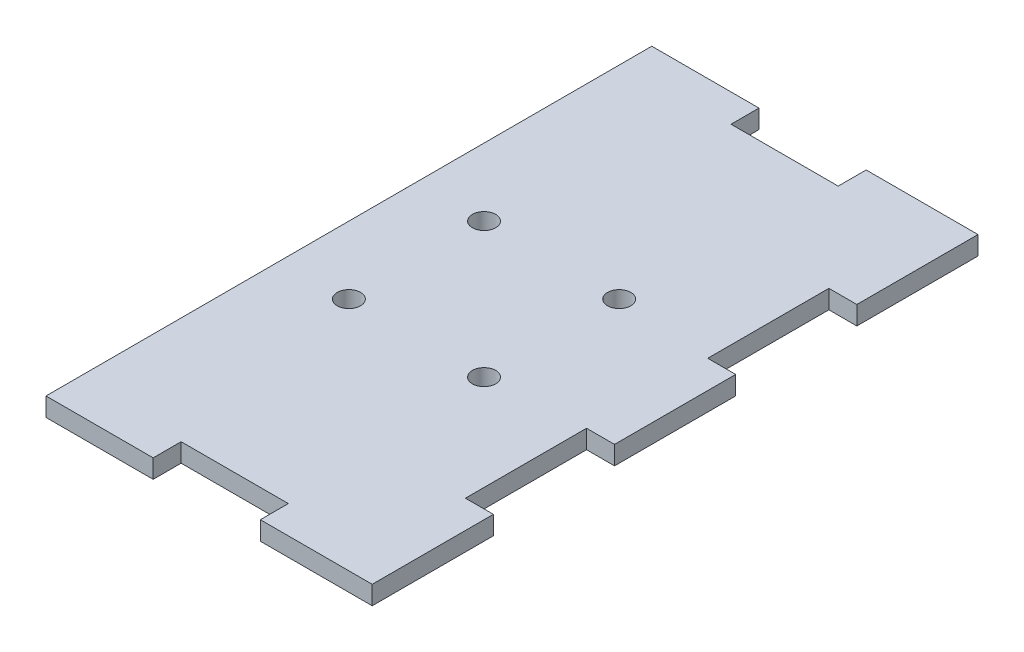
ISO-10303-21;
HEADER;
FILE_DESCRIPTION(('STEP AP214'),'2;1');
FILE_NAME('part.step','',(''),(''),'','','');
FILE_SCHEMA(('AUTOMOTIVE_DESIGN { 1 0 10303 214 1 1 1 1 }'));
ENDSEC;
DATA;
#1=APPLICATION_CONTEXT('core data for automotive mechanical design processes');
#2=APPLICATION_PROTOCOL_DEFINITION('international standard','automotive_design',2000,#1);
#3=PRODUCT_CONTEXT('',#1,'mechanical');
#4=PRODUCT('Part','Part','',(#3));
#5=PRODUCT_RELATED_PRODUCT_CATEGORY('part','',(#4));
#6=PRODUCT_DEFINITION_FORMATION('','',#4);
#7=PRODUCT_DEFINITION_CONTEXT('part definition',#1,'design');
#8=PRODUCT_DEFINITION('design','',#6,#7);
#9=PRODUCT_DEFINITION_SHAPE('','',#8);
#10=(LENGTH_UNIT() NAMED_UNIT(*) SI_UNIT(.MILLI.,.METRE.));
#11=(NAMED_UNIT(*) PLANE_ANGLE_UNIT() SI_UNIT($,.RADIAN.));
#12=(NAMED_UNIT(*) SI_UNIT($,.STERADIAN.) SOLID_ANGLE_UNIT());
#13=UNCERTAINTY_MEASURE_WITH_UNIT(LENGTH_MEASURE(1.E-05),#10,'distance_accuracy_value','');
#14=(GEOMETRIC_REPRESENTATION_CONTEXT(3) GLOBAL_UNCERTAINTY_ASSIGNED_CONTEXT((#13)) GLOBAL_UNIT_ASSIGNED_CONTEXT((#10,
#11,#12)) REPRESENTATION_CONTEXT('',''));
#15=CARTESIAN_POINT('',(0.,0.,0.));
#16=DIRECTION('',(0.,0.,1.));
#17=DIRECTION('',(1.,0.,0.));
#18=AXIS2_PLACEMENT_3D('',#15,#16,#17);
#19=CARTESIAN_POINT('',(0.,4.,0.));
#20=DIRECTION('',(0.,0.,-1.));
#21=DIRECTION('',(-1.,0.,0.));
#22=AXIS2_PLACEMENT_3D('',#19,#20,#21);
#23=PLANE('',#22);
#24=DIRECTION('',(0.,1.,0.));
#25=VECTOR('',#24,1.);
#26=CARTESIAN_POINT('',(23.,0.,0.));
#27=LINE('',#26,#25);
#28=CARTESIAN_POINT('',(23.,0.,0.));
#29=VERTEX_POINT('',#28);
#30=CARTESIAN_POINT('',(23.,4.,0.));
#31=VERTEX_POINT('',#30);
#32=EDGE_CURVE('E278',#29,#31,#27,.T.);
#33=ORIENTED_EDGE('',*,*,#32,.T.);
#34=DIRECTION('',(1.,0.,0.));
#35=VECTOR('',#34,1.);
#36=CARTESIAN_POINT('',(0.,4.,0.));
#37=LINE('',#36,#35);
#38=CARTESIAN_POINT('',(0.,4.,0.));
#39=VERTEX_POINT('',#38);
#40=EDGE_CURVE('E252',#39,#31,#37,.T.);
#41=ORIENTED_EDGE('',*,*,#40,.F.);
#42=DIRECTION('',(0.,-1.,0.));
#43=VECTOR('',#42,1.);
#44=CARTESIAN_POINT('',(0.,4.,0.));
#45=LINE('',#44,#43);
#46=CARTESIAN_POINT('',(0.,0.,0.));
#47=VERTEX_POINT('',#46);
#48=EDGE_CURVE('E11',#39,#47,#45,.T.);
#49=ORIENTED_EDGE('',*,*,#48,.T.);
#50=DIRECTION('',(1.,0.,0.));
#51=VECTOR('',#50,1.);
#52=CARTESIAN_POINT('',(0.,0.,0.));
#53=LINE('',#52,#51);
#54=EDGE_CURVE('E203',#47,#29,#53,.T.);
#55=ORIENTED_EDGE('',*,*,#54,.T.);
#56=EDGE_LOOP('',(#33,#41,#49,#55));
#57=FACE_BOUND('',#56,.T.);
#58=ADVANCED_FACE('F39',(#57),#23,.F.);
#59=CARTESIAN_POINT('',(70.,4.,0.));
#60=DIRECTION('',(-1.,0.,0.));
#61=DIRECTION('',(0.,0.,1.));
#62=AXIS2_PLACEMENT_3D('',#59,#60,#61);
#63=PLANE('',#62);
#64=DIRECTION('',(0.,1.,0.));
#65=VECTOR('',#64,1.);
#66=CARTESIAN_POINT('',(70.,0.,-52.));
#67=LINE('',#66,#65);
#68=CARTESIAN_POINT('',(70.,0.,-52.));
#69=VERTEX_POINT('',#68);
#70=CARTESIAN_POINT('',(70.,4.,-52.));
#71=VERTEX_POINT('',#70);
#72=EDGE_CURVE('E375',#69,#71,#67,.T.);
#73=ORIENTED_EDGE('',*,*,#72,.F.);
#74=DIRECTION('',(0.,0.,-1.));
#75=VECTOR('',#74,1.);
#76=CARTESIAN_POINT('',(70.,0.,0.));
#77=LINE('',#76,#75);
#78=CARTESIAN_POINT('',(70.,0.,-78.));
#79=VERTEX_POINT('',#78);
#80=EDGE_CURVE('E218',#69,#79,#77,.T.);
#81=ORIENTED_EDGE('',*,*,#80,.T.);
#82=DIRECTION('',(0.,1.,0.));
#83=VECTOR('',#82,1.);
#84=CARTESIAN_POINT('',(70.,0.,-78.));
#85=LINE('',#84,#83);
#86=CARTESIAN_POINT('',(70.,4.,-78.));
#87=VERTEX_POINT('',#86);
#88=EDGE_CURVE('E341',#79,#87,#85,.T.);
#89=ORIENTED_EDGE('',*,*,#88,.T.);
#90=DIRECTION('',(0.,0.,-1.));
#91=VECTOR('',#90,1.);
#92=CARTESIAN_POINT('',(70.,4.,0.));
#93=LINE('',#92,#91);
#94=EDGE_CURVE('E244',#71,#87,#93,.T.);
#95=ORIENTED_EDGE('',*,*,#94,.F.);
#96=EDGE_LOOP('',(#73,#81,#89,#95));
#97=FACE_BOUND('',#96,.T.);
#98=ADVANCED_FACE('F468',(#97),#63,.F.);
#99=DIRECTION('',(0.,1.,0.));
#100=VECTOR('',#99,1.);
#101=CARTESIAN_POINT('',(70.,0.,-26.));
#102=LINE('',#101,#100);
#103=CARTESIAN_POINT('',(70.,0.,-26.));
#104=VERTEX_POINT('',#103);
#105=CARTESIAN_POINT('',(70.,4.,-26.));
#106=VERTEX_POINT('',#105);
#107=EDGE_CURVE('E239',#104,#106,#102,.T.);
#108=ORIENTED_EDGE('',*,*,#107,.T.);
#109=CARTESIAN_POINT('',(70.,4.,0.));
#110=VERTEX_POINT('',#109);
#111=EDGE_CURVE('E238',#110,#106,#93,.T.);
#112=ORIENTED_EDGE('',*,*,#111,.F.);
#113=DIRECTION('',(0.,-1.,0.));
#114=VECTOR('',#113,1.);
#115=CARTESIAN_POINT('',(70.,4.,0.));
#116=LINE('',#115,#114);
#117=CARTESIAN_POINT('',(70.,0.,0.));
#118=VERTEX_POINT('',#117);
#119=EDGE_CURVE('E48',#110,#118,#116,.T.);
#120=ORIENTED_EDGE('',*,*,#119,.T.);
#121=EDGE_CURVE('E201',#118,#104,#77,.T.);
#122=ORIENTED_EDGE('',*,*,#121,.T.);
#123=EDGE_LOOP('',(#108,#112,#120,#122));
#124=FACE_BOUND('',#123,.T.);
#125=ADVANCED_FACE('F236',(#124),#63,.F.);
#126=DIRECTION('',(0.,1.,0.));
#127=VECTOR('',#126,1.);
#128=CARTESIAN_POINT('',(70.,0.,-104.));
#129=LINE('',#128,#127);
#130=CARTESIAN_POINT('',(70.,0.,-104.));
#131=VERTEX_POINT('',#130);
#132=CARTESIAN_POINT('',(70.,4.,-104.));
#133=VERTEX_POINT('',#132);
#134=EDGE_CURVE('E345',#131,#133,#129,.T.);
#135=ORIENTED_EDGE('',*,*,#134,.F.);
#136=CARTESIAN_POINT('',(70.,0.,-130.));
#137=VERTEX_POINT('',#136);
#138=EDGE_CURVE('E209',#131,#137,#77,.T.);
#139=ORIENTED_EDGE('',*,*,#138,.T.);
#140=DIRECTION('',(0.,-1.,0.));
#141=VECTOR('',#140,1.);
#142=CARTESIAN_POINT('',(70.,4.,-130.));
#143=LINE('',#142,#141);
#144=CARTESIAN_POINT('',(70.,4.,-130.));
#145=VERTEX_POINT('',#144);
#146=EDGE_CURVE('E228',#145,#137,#143,.T.);
#147=ORIENTED_EDGE('',*,*,#146,.F.);
#148=EDGE_CURVE('E246',#133,#145,#93,.T.);
#149=ORIENTED_EDGE('',*,*,#148,.F.);
#150=EDGE_LOOP('',(#135,#139,#147,#149));
#151=FACE_BOUND('',#150,.T.);
#152=ADVANCED_FACE('F438',(#151),#63,.F.);
#153=CARTESIAN_POINT('',(0.,4.,-130.));
#154=DIRECTION('',(0.,0.,1.));
#155=DIRECTION('',(1.,0.,0.));
#156=AXIS2_PLACEMENT_3D('',#153,#154,#155);
#157=PLANE('',#156);
#158=DIRECTION('',(-1.,0.,0.));
#159=VECTOR('',#158,1.);
#160=CARTESIAN_POINT('',(0.,4.,-130.));
#161=LINE('',#160,#159);
#162=CARTESIAN_POINT('',(23.,4.,-130.));
#163=VERTEX_POINT('',#162);
#164=CARTESIAN_POINT('',(0.,4.,-130.));
#165=VERTEX_POINT('',#164);
#166=EDGE_CURVE('E243',#163,#165,#161,.T.);
#167=ORIENTED_EDGE('',*,*,#166,.F.);
#168=DIRECTION('',(0.,1.,0.));
#169=VECTOR('',#168,1.);
#170=CARTESIAN_POINT('',(23.,0.,-130.));
#171=LINE('',#170,#169);
#172=CARTESIAN_POINT('',(23.,0.,-130.));
#173=VERTEX_POINT('',#172);
#174=EDGE_CURVE('E305',#173,#163,#171,.T.);
#175=ORIENTED_EDGE('',*,*,#174,.F.);
#176=DIRECTION('',(-1.,0.,0.));
#177=VECTOR('',#176,1.);
#178=CARTESIAN_POINT('',(0.,0.,-130.));
#179=LINE('',#178,#177);
#180=CARTESIAN_POINT('',(0.,0.,-130.));
#181=VERTEX_POINT('',#180);
#182=EDGE_CURVE('E217',#173,#181,#179,.T.);
#183=ORIENTED_EDGE('',*,*,#182,.T.);
#184=DIRECTION('',(0.,-1.,0.));
#185=VECTOR('',#184,1.);
#186=CARTESIAN_POINT('',(0.,4.,-130.));
#187=LINE('',#186,#185);
#188=EDGE_CURVE('E224',#165,#181,#187,.T.);
#189=ORIENTED_EDGE('',*,*,#188,.F.);
#190=EDGE_LOOP('',(#167,#175,#183,#189));
#191=FACE_BOUND('',#190,.T.);
#192=ADVANCED_FACE('F458',(#191),#157,.F.);
#193=CARTESIAN_POINT('',(0.,4.,0.));
#194=DIRECTION('',(0.,-1.,0.));
#195=DIRECTION('',(0.,0.,-1.));
#196=AXIS2_PLACEMENT_3D('',#193,#194,#195);
#197=PLANE('',#196);
#198=CARTESIAN_POINT('',(14.5,4.,-79.5));
#199=DIRECTION('',(0.,1.,0.));
#200=DIRECTION('',(0.,0.,1.));
#201=AXIS2_PLACEMENT_3D('',#198,#199,#200);
#202=CIRCLE('',#201,2.5);
#203=CARTESIAN_POINT('',(14.5,4.,-77.));
#204=VERTEX_POINT('',#203);
#205=EDGE_CURVE('E265',#204,#204,#202,.T.);
#206=ORIENTED_EDGE('',*,*,#205,.F.);
#207=EDGE_LOOP('',(#206));
#208=FACE_BOUND('',#207,.T.);
#209=CARTESIAN_POINT('',(14.5,4.,-50.5));
#210=DIRECTION('',(0.,1.,0.));
#211=DIRECTION('',(0.,0.,1.));
#212=AXIS2_PLACEMENT_3D('',#209,#210,#211);
#213=CIRCLE('',#212,2.5);
#214=CARTESIAN_POINT('',(14.5,4.,-48.));
#215=VERTEX_POINT('',#214);
#216=EDGE_CURVE('E290',#215,#215,#213,.T.);
#217=ORIENTED_EDGE('',*,*,#216,.F.);
#218=EDGE_LOOP('',(#217));
#219=FACE_BOUND('',#218,.T.);
#220=CARTESIAN_POINT('',(43.5,4.,-50.5));
#221=DIRECTION('',(0.,1.,0.));
#222=DIRECTION('',(0.,0.,1.));
#223=AXIS2_PLACEMENT_3D('',#220,#221,#222);
#224=CIRCLE('',#223,2.5);
#225=CARTESIAN_POINT('',(43.5,4.,-48.));
#226=VERTEX_POINT('',#225);
#227=EDGE_CURVE('E282',#226,#226,#224,.T.);
#228=ORIENTED_EDGE('',*,*,#227,.F.);
#229=EDGE_LOOP('',(#228));
#230=FACE_BOUND('',#229,.T.);
#231=CARTESIAN_POINT('',(43.5,4.,-79.5));
#232=DIRECTION('',(0.,1.,0.));
#233=DIRECTION('',(0.,0.,1.));
#234=AXIS2_PLACEMENT_3D('',#231,#232,#233);
#235=CIRCLE('',#234,2.5);
#236=CARTESIAN_POINT('',(43.5,4.,-77.));
#237=VERTEX_POINT('',#236);
#238=EDGE_CURVE('E273',#237,#237,#235,.T.);
#239=ORIENTED_EDGE('',*,*,#238,.F.);
#240=EDGE_LOOP('',(#239));
#241=FACE_BOUND('',#240,.T.);
#242=DIRECTION('',(0.,0.,-1.));
#243=VECTOR('',#242,1.);
#244=CARTESIAN_POINT('',(23.,4.,0.));
#245=LINE('',#244,#243);
#246=CARTESIAN_POINT('',(23.,4.,-6.));
#247=VERTEX_POINT('',#246);
#248=EDGE_CURVE('E185',#31,#247,#245,.T.);
#249=ORIENTED_EDGE('',*,*,#248,.T.);
#250=DIRECTION('',(1.,0.,0.));
#251=VECTOR('',#250,1.);
#252=CARTESIAN_POINT('',(0.,4.,-6.));
#253=LINE('',#252,#251);
#254=CARTESIAN_POINT('',(46.,4.,-6.));
#255=VERTEX_POINT('',#254);
#256=EDGE_CURVE('E407',#247,#255,#253,.T.);
#257=ORIENTED_EDGE('',*,*,#256,.T.);
#258=DIRECTION('',(0.,0.,-1.));
#259=VECTOR('',#258,1.);
#260=CARTESIAN_POINT('',(46.,4.,0.));
#261=LINE('',#260,#259);
#262=CARTESIAN_POINT('',(46.,4.,0.));
#263=VERTEX_POINT('',#262);
#264=EDGE_CURVE('E378',#263,#255,#261,.T.);
#265=ORIENTED_EDGE('',*,*,#264,.F.);
#266=EDGE_CURVE('E193',#263,#110,#37,.T.);
#267=ORIENTED_EDGE('',*,*,#266,.T.);
#268=ORIENTED_EDGE('',*,*,#111,.T.);
#269=DIRECTION('',(-1.,0.,0.));
#270=VECTOR('',#269,1.);
#271=CARTESIAN_POINT('',(0.,4.,-26.));
#272=LINE('',#271,#270);
#273=CARTESIAN_POINT('',(64.,4.,-26.));
#274=VERTEX_POINT('',#273);
#275=EDGE_CURVE('E379',#106,#274,#272,.T.);
#276=ORIENTED_EDGE('',*,*,#275,.T.);
#277=DIRECTION('',(0.,0.,-1.));
#278=VECTOR('',#277,1.);
#279=CARTESIAN_POINT('',(64.,4.,0.));
#280=LINE('',#279,#278);
#281=CARTESIAN_POINT('',(64.,4.,-52.));
#282=VERTEX_POINT('',#281);
#283=EDGE_CURVE('E383',#274,#282,#280,.T.);
#284=ORIENTED_EDGE('',*,*,#283,.T.);
#285=DIRECTION('',(1.,0.,0.));
#286=VECTOR('',#285,1.);
#287=CARTESIAN_POINT('',(0.,4.,-52.));
#288=LINE('',#287,#286);
#289=EDGE_CURVE('E348',#282,#71,#288,.T.);
#290=ORIENTED_EDGE('',*,*,#289,.T.);
#291=ORIENTED_EDGE('',*,*,#94,.T.);
#292=DIRECTION('',(1.,0.,0.));
#293=VECTOR('',#292,1.);
#294=CARTESIAN_POINT('',(0.,4.,-78.));
#295=LINE('',#294,#293);
#296=CARTESIAN_POINT('',(64.,4.,-78.));
#297=VERTEX_POINT('',#296);
#298=EDGE_CURVE('E349',#297,#87,#295,.T.);
#299=ORIENTED_EDGE('',*,*,#298,.F.);
#300=DIRECTION('',(0.,0.,-1.));
#301=VECTOR('',#300,1.);
#302=CARTESIAN_POINT('',(64.,4.,0.));
#303=LINE('',#302,#301);
#304=CARTESIAN_POINT('',(64.,4.,-104.));
#305=VERTEX_POINT('',#304);
#306=EDGE_CURVE('E353',#297,#305,#303,.T.);
#307=ORIENTED_EDGE('',*,*,#306,.T.);
#308=DIRECTION('',(1.,0.,0.));
#309=VECTOR('',#308,1.);
#310=CARTESIAN_POINT('',(0.,4.,-104.));
#311=LINE('',#310,#309);
#312=EDGE_CURVE('E311',#305,#133,#311,.T.);
#313=ORIENTED_EDGE('',*,*,#312,.T.);
#314=ORIENTED_EDGE('',*,*,#148,.T.);
#315=CARTESIAN_POINT('',(46.,4.,-130.));
#316=VERTEX_POINT('',#315);
#317=EDGE_CURVE('E229',#145,#316,#161,.T.);
#318=ORIENTED_EDGE('',*,*,#317,.T.);
#319=DIRECTION('',(0.,0.,-1.));
#320=VECTOR('',#319,1.);
#321=CARTESIAN_POINT('',(46.,4.,0.));
#322=LINE('',#321,#320);
#323=CARTESIAN_POINT('',(46.,4.,-124.));
#324=VERTEX_POINT('',#323);
#325=EDGE_CURVE('E317',#324,#316,#322,.T.);
#326=ORIENTED_EDGE('',*,*,#325,.F.);
#327=DIRECTION('',(1.,0.,0.));
#328=VECTOR('',#327,1.);
#329=CARTESIAN_POINT('',(0.,4.,-124.));
#330=LINE('',#329,#328);
#331=CARTESIAN_POINT('',(23.,4.,-124.));
#332=VERTEX_POINT('',#331);
#333=EDGE_CURVE('E320',#332,#324,#330,.T.);
#334=ORIENTED_EDGE('',*,*,#333,.F.);
#335=DIRECTION('',(0.,0.,1.));
#336=VECTOR('',#335,1.);
#337=CARTESIAN_POINT('',(23.,4.,0.));
#338=LINE('',#337,#336);
#339=EDGE_CURVE('E312',#163,#332,#338,.T.);
#340=ORIENTED_EDGE('',*,*,#339,.F.);
#341=ORIENTED_EDGE('',*,*,#166,.T.);
#342=DIRECTION('',(0.,0.,1.));
#343=VECTOR('',#342,1.);
#344=CARTESIAN_POINT('',(0.,4.,0.));
#345=LINE('',#344,#343);
#346=EDGE_CURVE('E223',#165,#39,#345,.T.);
#347=ORIENTED_EDGE('',*,*,#346,.T.);
#348=ORIENTED_EDGE('',*,*,#40,.T.);
#349=EDGE_LOOP('',(#249,#257,#265,#267,#268,#276,#284,#290,#291,#299,#307,#313,#314,#318,#326,
#334,#340,#341,#347,#348));
#350=FACE_BOUND('',#349,.T.);
#351=ADVANCED_FACE('F449',(#208,#219,#230,#241,#350),#197,.F.);
#352=CARTESIAN_POINT('',(0.,0.,0.));
#353=DIRECTION('',(0.,-1.,0.));
#354=DIRECTION('',(0.,0.,-1.));
#355=AXIS2_PLACEMENT_3D('',#352,#353,#354);
#356=PLANE('',#355);
#357=CARTESIAN_POINT('',(43.5,0.,-79.5));
#358=DIRECTION('',(0.,1.,0.));
#359=DIRECTION('',(0.,0.,1.));
#360=AXIS2_PLACEMENT_3D('',#357,#358,#359);
#361=CIRCLE('',#360,2.5);
#362=CARTESIAN_POINT('',(43.5,0.,-77.));
#363=VERTEX_POINT('',#362);
#364=EDGE_CURVE('E277',#363,#363,#361,.T.);
#365=ORIENTED_EDGE('',*,*,#364,.T.);
#366=EDGE_LOOP('',(#365));
#367=FACE_BOUND('',#366,.T.);
#368=CARTESIAN_POINT('',(43.5,0.,-50.5));
#369=DIRECTION('',(0.,1.,0.));
#370=DIRECTION('',(0.,0.,1.));
#371=AXIS2_PLACEMENT_3D('',#368,#369,#370);
#372=CIRCLE('',#371,2.5);
#373=CARTESIAN_POINT('',(43.5,0.,-48.));
#374=VERTEX_POINT('',#373);
#375=EDGE_CURVE('E286',#374,#374,#372,.T.);
#376=ORIENTED_EDGE('',*,*,#375,.T.);
#377=EDGE_LOOP('',(#376));
#378=FACE_BOUND('',#377,.T.);
#379=CARTESIAN_POINT('',(14.5,0.,-50.5));
#380=DIRECTION('',(0.,1.,0.));
#381=DIRECTION('',(0.,0.,1.));
#382=AXIS2_PLACEMENT_3D('',#379,#380,#381);
#383=CIRCLE('',#382,2.5);
#384=CARTESIAN_POINT('',(14.5,0.,-48.));
#385=VERTEX_POINT('',#384);
#386=EDGE_CURVE('E269',#385,#385,#383,.T.);
#387=ORIENTED_EDGE('',*,*,#386,.T.);
#388=EDGE_LOOP('',(#387));
#389=FACE_BOUND('',#388,.T.);
#390=CARTESIAN_POINT('',(14.5,0.,-79.5));
#391=DIRECTION('',(0.,1.,0.));
#392=DIRECTION('',(0.,0.,1.));
#393=AXIS2_PLACEMENT_3D('',#390,#391,#392);
#394=CIRCLE('',#393,2.5);
#395=CARTESIAN_POINT('',(14.5,0.,-77.));
#396=VERTEX_POINT('',#395);
#397=EDGE_CURVE('E211',#396,#396,#394,.T.);
#398=ORIENTED_EDGE('',*,*,#397,.T.);
#399=EDGE_LOOP('',(#398));
#400=FACE_BOUND('',#399,.T.);
#401=DIRECTION('',(1.,0.,0.));
#402=VECTOR('',#401,1.);
#403=CARTESIAN_POINT('',(0.,0.,-6.));
#404=LINE('',#403,#402);
#405=CARTESIAN_POINT('',(23.,0.,-6.));
#406=VERTEX_POINT('',#405);
#407=CARTESIAN_POINT('',(46.,0.,-6.));
#408=VERTEX_POINT('',#407);
#409=EDGE_CURVE('E184',#406,#408,#404,.T.);
#410=ORIENTED_EDGE('',*,*,#409,.F.);
#411=DIRECTION('',(0.,0.,-1.));
#412=VECTOR('',#411,1.);
#413=CARTESIAN_POINT('',(23.,0.,0.));
#414=LINE('',#413,#412);
#415=EDGE_CURVE('E195',#29,#406,#414,.T.);
#416=ORIENTED_EDGE('',*,*,#415,.F.);
#417=ORIENTED_EDGE('',*,*,#54,.F.);
#418=DIRECTION('',(0.,0.,1.));
#419=VECTOR('',#418,1.);
#420=CARTESIAN_POINT('',(0.,0.,0.));
#421=LINE('',#420,#419);
#422=EDGE_CURVE('E204',#181,#47,#421,.T.);
#423=ORIENTED_EDGE('',*,*,#422,.F.);
#424=ORIENTED_EDGE('',*,*,#182,.F.);
#425=DIRECTION('',(0.,0.,1.));
#426=VECTOR('',#425,1.);
#427=CARTESIAN_POINT('',(23.,0.,0.));
#428=LINE('',#427,#426);
#429=CARTESIAN_POINT('',(23.,0.,-124.));
#430=VERTEX_POINT('',#429);
#431=EDGE_CURVE('E301',#173,#430,#428,.T.);
#432=ORIENTED_EDGE('',*,*,#431,.T.);
#433=DIRECTION('',(1.,0.,0.));
#434=VECTOR('',#433,1.);
#435=CARTESIAN_POINT('',(0.,0.,-124.));
#436=LINE('',#435,#434);
#437=CARTESIAN_POINT('',(46.,0.,-124.));
#438=VERTEX_POINT('',#437);
#439=EDGE_CURVE('E316',#430,#438,#436,.T.);
#440=ORIENTED_EDGE('',*,*,#439,.T.);
#441=DIRECTION('',(0.,0.,-1.));
#442=VECTOR('',#441,1.);
#443=CARTESIAN_POINT('',(46.,0.,0.));
#444=LINE('',#443,#442);
#445=CARTESIAN_POINT('',(46.,0.,-130.));
#446=VERTEX_POINT('',#445);
#447=EDGE_CURVE('E327',#438,#446,#444,.T.);
#448=ORIENTED_EDGE('',*,*,#447,.T.);
#449=EDGE_CURVE('E219',#137,#446,#179,.T.);
#450=ORIENTED_EDGE('',*,*,#449,.F.);
#451=ORIENTED_EDGE('',*,*,#138,.F.);
#452=DIRECTION('',(1.,0.,0.));
#453=VECTOR('',#452,1.);
#454=CARTESIAN_POINT('',(0.,0.,-104.));
#455=LINE('',#454,#453);
#456=CARTESIAN_POINT('',(64.,0.,-104.));
#457=VERTEX_POINT('',#456);
#458=EDGE_CURVE('E352',#457,#131,#455,.T.);
#459=ORIENTED_EDGE('',*,*,#458,.F.);
#460=DIRECTION('',(0.,0.,-1.));
#461=VECTOR('',#460,1.);
#462=CARTESIAN_POINT('',(64.,0.,0.));
#463=LINE('',#462,#461);
#464=CARTESIAN_POINT('',(64.,0.,-78.));
#465=VERTEX_POINT('',#464);
#466=EDGE_CURVE('E362',#465,#457,#463,.T.);
#467=ORIENTED_EDGE('',*,*,#466,.F.);
#468=DIRECTION('',(1.,0.,0.));
#469=VECTOR('',#468,1.);
#470=CARTESIAN_POINT('',(0.,0.,-78.));
#471=LINE('',#470,#469);
#472=EDGE_CURVE('E338',#465,#79,#471,.T.);
#473=ORIENTED_EDGE('',*,*,#472,.T.);
#474=ORIENTED_EDGE('',*,*,#80,.F.);
#475=DIRECTION('',(1.,0.,0.));
#476=VECTOR('',#475,1.);
#477=CARTESIAN_POINT('',(0.,0.,-52.));
#478=LINE('',#477,#476);
#479=CARTESIAN_POINT('',(64.,0.,-52.));
#480=VERTEX_POINT('',#479);
#481=EDGE_CURVE('E382',#480,#69,#478,.T.);
#482=ORIENTED_EDGE('',*,*,#481,.F.);
#483=DIRECTION('',(0.,0.,-1.));
#484=VECTOR('',#483,1.);
#485=CARTESIAN_POINT('',(64.,0.,0.));
#486=LINE('',#485,#484);
#487=CARTESIAN_POINT('',(64.,0.,-26.));
#488=VERTEX_POINT('',#487);
#489=EDGE_CURVE('E392',#488,#480,#486,.T.);
#490=ORIENTED_EDGE('',*,*,#489,.F.);
#491=DIRECTION('',(-1.,0.,0.));
#492=VECTOR('',#491,1.);
#493=CARTESIAN_POINT('',(0.,0.,-26.));
#494=LINE('',#493,#492);
#495=EDGE_CURVE('E370',#104,#488,#494,.T.);
#496=ORIENTED_EDGE('',*,*,#495,.F.);
#497=ORIENTED_EDGE('',*,*,#121,.F.);
#498=CARTESIAN_POINT('',(46.,0.,0.));
#499=VERTEX_POINT('',#498);
#500=EDGE_CURVE('E191',#499,#118,#53,.T.);
#501=ORIENTED_EDGE('',*,*,#500,.F.);
#502=DIRECTION('',(0.,0.,-1.));
#503=VECTOR('',#502,1.);
#504=CARTESIAN_POINT('',(46.,0.,0.));
#505=LINE('',#504,#503);
#506=EDGE_CURVE('E175',#499,#408,#505,.T.);
#507=ORIENTED_EDGE('',*,*,#506,.T.);
#508=EDGE_LOOP('',(#410,#416,#417,#423,#424,#432,#440,#448,#450,#451,#459,#467,#473,#474,#482,
#490,#496,#497,#501,#507));
#509=FACE_BOUND('',#508,.T.);
#510=ADVANCED_FACE('F198',(#367,#378,#389,#400,#509),#356,.T.);
#511=CARTESIAN_POINT('',(0.,4.,0.));
#512=DIRECTION('',(1.,0.,0.));
#513=DIRECTION('',(0.,0.,-1.));
#514=AXIS2_PLACEMENT_3D('',#511,#512,#513);
#515=PLANE('',#514);
#516=ORIENTED_EDGE('',*,*,#422,.T.);
#517=ORIENTED_EDGE('',*,*,#48,.F.);
#518=ORIENTED_EDGE('',*,*,#346,.F.);
#519=ORIENTED_EDGE('',*,*,#188,.T.);
#520=EDGE_LOOP('',(#516,#517,#518,#519));
#521=FACE_BOUND('',#520,.T.);
#522=ADVANCED_FACE('F41',(#521),#515,.F.);
#523=ORIENTED_EDGE('',*,*,#266,.F.);
#524=DIRECTION('',(0.,1.,0.));
#525=VECTOR('',#524,1.);
#526=CARTESIAN_POINT('',(46.,0.,0.));
#527=LINE('',#526,#525);
#528=EDGE_CURVE('E178',#499,#263,#527,.T.);
#529=ORIENTED_EDGE('',*,*,#528,.F.);
#530=ORIENTED_EDGE('',*,*,#500,.T.);
#531=ORIENTED_EDGE('',*,*,#119,.F.);
#532=EDGE_LOOP('',(#523,#529,#530,#531));
#533=FACE_BOUND('',#532,.T.);
#534=ADVANCED_FACE('F189',(#533),#23,.F.);
#535=ORIENTED_EDGE('',*,*,#449,.T.);
#536=DIRECTION('',(0.,1.,0.));
#537=VECTOR('',#536,1.);
#538=CARTESIAN_POINT('',(46.,0.,-130.));
#539=LINE('',#538,#537);
#540=EDGE_CURVE('E300',#446,#316,#539,.T.);
#541=ORIENTED_EDGE('',*,*,#540,.T.);
#542=ORIENTED_EDGE('',*,*,#317,.F.);
#543=ORIENTED_EDGE('',*,*,#146,.T.);
#544=EDGE_LOOP('',(#535,#541,#542,#543));
#545=FACE_BOUND('',#544,.T.);
#546=ADVANCED_FACE('F443',(#545),#157,.F.);
#547=CARTESIAN_POINT('',(14.5,0.,-79.5));
#548=DIRECTION('',(0.,1.,0.));
#549=DIRECTION('',(0.,0.,1.));
#550=AXIS2_PLACEMENT_3D('',#547,#548,#549);
#551=CYLINDRICAL_SURFACE('',#550,2.5);
#552=ORIENTED_EDGE('',*,*,#397,.F.);
#553=EDGE_LOOP('',(#552));
#554=FACE_BOUND('',#553,.T.);
#555=ORIENTED_EDGE('',*,*,#205,.T.);
#556=EDGE_LOOP('',(#555));
#557=FACE_BOUND('',#556,.T.);
#558=ADVANCED_FACE('F471',(#554,#557),#551,.F.);
#559=CARTESIAN_POINT('',(14.5,0.,-50.5));
#560=DIRECTION('',(0.,1.,0.));
#561=DIRECTION('',(0.,0.,1.));
#562=AXIS2_PLACEMENT_3D('',#559,#560,#561);
#563=CYLINDRICAL_SURFACE('',#562,2.5);
#564=ORIENTED_EDGE('',*,*,#386,.F.);
#565=EDGE_LOOP('',(#564));
#566=FACE_BOUND('',#565,.T.);
#567=ORIENTED_EDGE('',*,*,#216,.T.);
#568=EDGE_LOOP('',(#567));
#569=FACE_BOUND('',#568,.T.);
#570=ADVANCED_FACE('F491',(#566,#569),#563,.F.);
#571=CARTESIAN_POINT('',(43.5,0.,-50.5));
#572=DIRECTION('',(0.,1.,0.));
#573=DIRECTION('',(0.,0.,1.));
#574=AXIS2_PLACEMENT_3D('',#571,#572,#573);
#575=CYLINDRICAL_SURFACE('',#574,2.5);
#576=ORIENTED_EDGE('',*,*,#375,.F.);
#577=EDGE_LOOP('',(#576));
#578=FACE_BOUND('',#577,.T.);
#579=ORIENTED_EDGE('',*,*,#227,.T.);
#580=EDGE_LOOP('',(#579));
#581=FACE_BOUND('',#580,.T.);
#582=ADVANCED_FACE('F496',(#578,#581),#575,.F.);
#583=CARTESIAN_POINT('',(43.5,0.,-79.5));
#584=DIRECTION('',(0.,1.,0.));
#585=DIRECTION('',(0.,0.,1.));
#586=AXIS2_PLACEMENT_3D('',#583,#584,#585);
#587=CYLINDRICAL_SURFACE('',#586,2.5);
#588=ORIENTED_EDGE('',*,*,#364,.F.);
#589=EDGE_LOOP('',(#588));
#590=FACE_BOUND('',#589,.T.);
#591=ORIENTED_EDGE('',*,*,#238,.T.);
#592=EDGE_LOOP('',(#591));
#593=FACE_BOUND('',#592,.T.);
#594=ADVANCED_FACE('F493',(#590,#593),#587,.F.);
#595=CARTESIAN_POINT('',(0.,0.,-124.));
#596=DIRECTION('',(0.,0.,1.));
#597=DIRECTION('',(1.,0.,0.));
#598=AXIS2_PLACEMENT_3D('',#595,#596,#597);
#599=PLANE('',#598);
#600=ORIENTED_EDGE('',*,*,#333,.T.);
#601=DIRECTION('',(0.,1.,0.));
#602=VECTOR('',#601,1.);
#603=CARTESIAN_POINT('',(46.,0.,-124.));
#604=LINE('',#603,#602);
#605=EDGE_CURVE('E297',#438,#324,#604,.T.);
#606=ORIENTED_EDGE('',*,*,#605,.F.);
#607=ORIENTED_EDGE('',*,*,#439,.F.);
#608=DIRECTION('',(0.,1.,0.));
#609=VECTOR('',#608,1.);
#610=CARTESIAN_POINT('',(23.,0.,-124.));
#611=LINE('',#610,#609);
#612=EDGE_CURVE('E308',#430,#332,#611,.T.);
#613=ORIENTED_EDGE('',*,*,#612,.T.);
#614=EDGE_LOOP('',(#600,#606,#607,#613));
#615=FACE_BOUND('',#614,.T.);
#616=ADVANCED_FACE('F455',(#615),#599,.F.);
#617=CARTESIAN_POINT('',(23.,0.,0.));
#618=DIRECTION('',(-1.,0.,0.));
#619=DIRECTION('',(0.,0.,1.));
#620=AXIS2_PLACEMENT_3D('',#617,#618,#619);
#621=PLANE('',#620);
#622=ORIENTED_EDGE('',*,*,#339,.T.);
#623=ORIENTED_EDGE('',*,*,#612,.F.);
#624=ORIENTED_EDGE('',*,*,#431,.F.);
#625=ORIENTED_EDGE('',*,*,#174,.T.);
#626=EDGE_LOOP('',(#622,#623,#624,#625));
#627=FACE_BOUND('',#626,.T.);
#628=ADVANCED_FACE('F457',(#627),#621,.F.);
#629=CARTESIAN_POINT('',(46.,0.,0.));
#630=DIRECTION('',(1.,0.,0.));
#631=DIRECTION('',(0.,0.,-1.));
#632=AXIS2_PLACEMENT_3D('',#629,#630,#631);
#633=PLANE('',#632);
#634=ORIENTED_EDGE('',*,*,#325,.T.);
#635=ORIENTED_EDGE('',*,*,#540,.F.);
#636=ORIENTED_EDGE('',*,*,#447,.F.);
#637=ORIENTED_EDGE('',*,*,#605,.T.);
#638=EDGE_LOOP('',(#634,#635,#636,#637));
#639=FACE_BOUND('',#638,.T.);
#640=ADVANCED_FACE('F447',(#639),#633,.F.);
#641=CARTESIAN_POINT('',(0.,0.,-104.));
#642=DIRECTION('',(0.,0.,1.));
#643=DIRECTION('',(1.,0.,0.));
#644=AXIS2_PLACEMENT_3D('',#641,#642,#643);
#645=PLANE('',#644);
#646=ORIENTED_EDGE('',*,*,#312,.F.);
#647=DIRECTION('',(0.,1.,0.));
#648=VECTOR('',#647,1.);
#649=CARTESIAN_POINT('',(64.,0.,-104.));
#650=LINE('',#649,#648);
#651=EDGE_CURVE('E334',#457,#305,#650,.T.);
#652=ORIENTED_EDGE('',*,*,#651,.F.);
#653=ORIENTED_EDGE('',*,*,#458,.T.);
#654=ORIENTED_EDGE('',*,*,#134,.T.);
#655=EDGE_LOOP('',(#646,#652,#653,#654));
#656=FACE_BOUND('',#655,.T.);
#657=ADVANCED_FACE('F508',(#656),#645,.T.);
#658=CARTESIAN_POINT('',(0.,0.,-78.));
#659=DIRECTION('',(0.,0.,1.));
#660=DIRECTION('',(1.,0.,0.));
#661=AXIS2_PLACEMENT_3D('',#658,#659,#660);
#662=PLANE('',#661);
#663=ORIENTED_EDGE('',*,*,#298,.T.);
#664=ORIENTED_EDGE('',*,*,#88,.F.);
#665=ORIENTED_EDGE('',*,*,#472,.F.);
#666=DIRECTION('',(0.,1.,0.));
#667=VECTOR('',#666,1.);
#668=CARTESIAN_POINT('',(64.,0.,-78.));
#669=LINE('',#668,#667);
#670=EDGE_CURVE('E337',#465,#297,#669,.T.);
#671=ORIENTED_EDGE('',*,*,#670,.T.);
#672=EDGE_LOOP('',(#663,#664,#665,#671));
#673=FACE_BOUND('',#672,.T.);
#674=ADVANCED_FACE('F513',(#673),#662,.F.);
#675=CARTESIAN_POINT('',(64.,0.,0.));
#676=DIRECTION('',(1.,0.,0.));
#677=DIRECTION('',(0.,0.,-1.));
#678=AXIS2_PLACEMENT_3D('',#675,#676,#677);
#679=PLANE('',#678);
#680=ORIENTED_EDGE('',*,*,#306,.F.);
#681=ORIENTED_EDGE('',*,*,#670,.F.);
#682=ORIENTED_EDGE('',*,*,#466,.T.);
#683=ORIENTED_EDGE('',*,*,#651,.T.);
#684=EDGE_LOOP('',(#680,#681,#682,#683));
#685=FACE_BOUND('',#684,.T.);
#686=ADVANCED_FACE('F515',(#685),#679,.T.);
#687=CARTESIAN_POINT('',(0.,0.,-52.));
#688=DIRECTION('',(0.,0.,1.));
#689=DIRECTION('',(1.,0.,0.));
#690=AXIS2_PLACEMENT_3D('',#687,#688,#689);
#691=PLANE('',#690);
#692=ORIENTED_EDGE('',*,*,#289,.F.);
#693=DIRECTION('',(0.,1.,0.));
#694=VECTOR('',#693,1.);
#695=CARTESIAN_POINT('',(64.,0.,-52.));
#696=LINE('',#695,#694);
#697=EDGE_CURVE('E367',#480,#282,#696,.T.);
#698=ORIENTED_EDGE('',*,*,#697,.F.);
#699=ORIENTED_EDGE('',*,*,#481,.T.);
#700=ORIENTED_EDGE('',*,*,#72,.T.);
#701=EDGE_LOOP('',(#692,#698,#699,#700));
#702=FACE_BOUND('',#701,.T.);
#703=ADVANCED_FACE('F518',(#702),#691,.T.);
#704=CARTESIAN_POINT('',(0.,0.,-26.));
#705=DIRECTION('',(0.,0.,-1.));
#706=DIRECTION('',(-1.,0.,0.));
#707=AXIS2_PLACEMENT_3D('',#704,#705,#706);
#708=PLANE('',#707);
#709=ORIENTED_EDGE('',*,*,#275,.F.);
#710=ORIENTED_EDGE('',*,*,#107,.F.);
#711=ORIENTED_EDGE('',*,*,#495,.T.);
#712=DIRECTION('',(0.,1.,0.));
#713=VECTOR('',#712,1.);
#714=CARTESIAN_POINT('',(64.,0.,-26.));
#715=LINE('',#714,#713);
#716=EDGE_CURVE('E63',#488,#274,#715,.T.);
#717=ORIENTED_EDGE('',*,*,#716,.T.);
#718=EDGE_LOOP('',(#709,#710,#711,#717));
#719=FACE_BOUND('',#718,.T.);
#720=ADVANCED_FACE('F525',(#719),#708,.T.);
#721=CARTESIAN_POINT('',(64.,0.,0.));
#722=DIRECTION('',(1.,0.,0.));
#723=DIRECTION('',(0.,0.,-1.));
#724=AXIS2_PLACEMENT_3D('',#721,#722,#723);
#725=PLANE('',#724);
#726=ORIENTED_EDGE('',*,*,#283,.F.);
#727=ORIENTED_EDGE('',*,*,#716,.F.);
#728=ORIENTED_EDGE('',*,*,#489,.T.);
#729=ORIENTED_EDGE('',*,*,#697,.T.);
#730=EDGE_LOOP('',(#726,#727,#728,#729));
#731=FACE_BOUND('',#730,.T.);
#732=ADVANCED_FACE('F527',(#731),#725,.T.);
#733=CARTESIAN_POINT('',(23.,0.,0.));
#734=DIRECTION('',(1.,0.,0.));
#735=DIRECTION('',(0.,0.,-1.));
#736=AXIS2_PLACEMENT_3D('',#733,#734,#735);
#737=PLANE('',#736);
#738=ORIENTED_EDGE('',*,*,#248,.F.);
#739=ORIENTED_EDGE('',*,*,#32,.F.);
#740=ORIENTED_EDGE('',*,*,#415,.T.);
#741=DIRECTION('',(0.,1.,0.));
#742=VECTOR('',#741,1.);
#743=CARTESIAN_POINT('',(23.,0.,-6.));
#744=LINE('',#743,#742);
#745=EDGE_CURVE('E399',#406,#247,#744,.T.);
#746=ORIENTED_EDGE('',*,*,#745,.T.);
#747=EDGE_LOOP('',(#738,#739,#740,#746));
#748=FACE_BOUND('',#747,.T.);
#749=ADVANCED_FACE('F530',(#748),#737,.T.);
#750=CARTESIAN_POINT('',(0.,0.,-6.));
#751=DIRECTION('',(0.,0.,1.));
#752=DIRECTION('',(1.,0.,0.));
#753=AXIS2_PLACEMENT_3D('',#750,#751,#752);
#754=PLANE('',#753);
#755=ORIENTED_EDGE('',*,*,#256,.F.);
#756=ORIENTED_EDGE('',*,*,#745,.F.);
#757=ORIENTED_EDGE('',*,*,#409,.T.);
#758=DIRECTION('',(0.,1.,0.));
#759=VECTOR('',#758,1.);
#760=CARTESIAN_POINT('',(46.,0.,-6.));
#761=LINE('',#760,#759);
#762=EDGE_CURVE('E55',#408,#255,#761,.T.);
#763=ORIENTED_EDGE('',*,*,#762,.T.);
#764=EDGE_LOOP('',(#755,#756,#757,#763));
#765=FACE_BOUND('',#764,.T.);
#766=ADVANCED_FACE('F419',(#765),#754,.T.);
#767=CARTESIAN_POINT('',(46.,0.,0.));
#768=DIRECTION('',(1.,0.,0.));
#769=DIRECTION('',(0.,0.,-1.));
#770=AXIS2_PLACEMENT_3D('',#767,#768,#769);
#771=PLANE('',#770);
#772=ORIENTED_EDGE('',*,*,#264,.T.);
#773=ORIENTED_EDGE('',*,*,#762,.F.);
#774=ORIENTED_EDGE('',*,*,#506,.F.);
#775=ORIENTED_EDGE('',*,*,#528,.T.);
#776=EDGE_LOOP('',(#772,#773,#774,#775));
#777=FACE_BOUND('',#776,.T.);
#778=ADVANCED_FACE('F177',(#777),#771,.F.);
#779=CLOSED_SHELL('',(#58,#98,#125,#152,#192,#351,#510,#522,#534,#546,#558,#570,#582,#594,#616,
#628,#640,#657,#674,#686,#703,#720,#732,#749,#766,#778));
#780=MANIFOLD_SOLID_BREP('B2',#779);
#781=ADVANCED_BREP_SHAPE_REPRESENTATION('',(#18,#780),#14);
#782=SHAPE_DEFINITION_REPRESENTATION(#9,#781);
ENDSEC;
END-ISO-10303-21;
